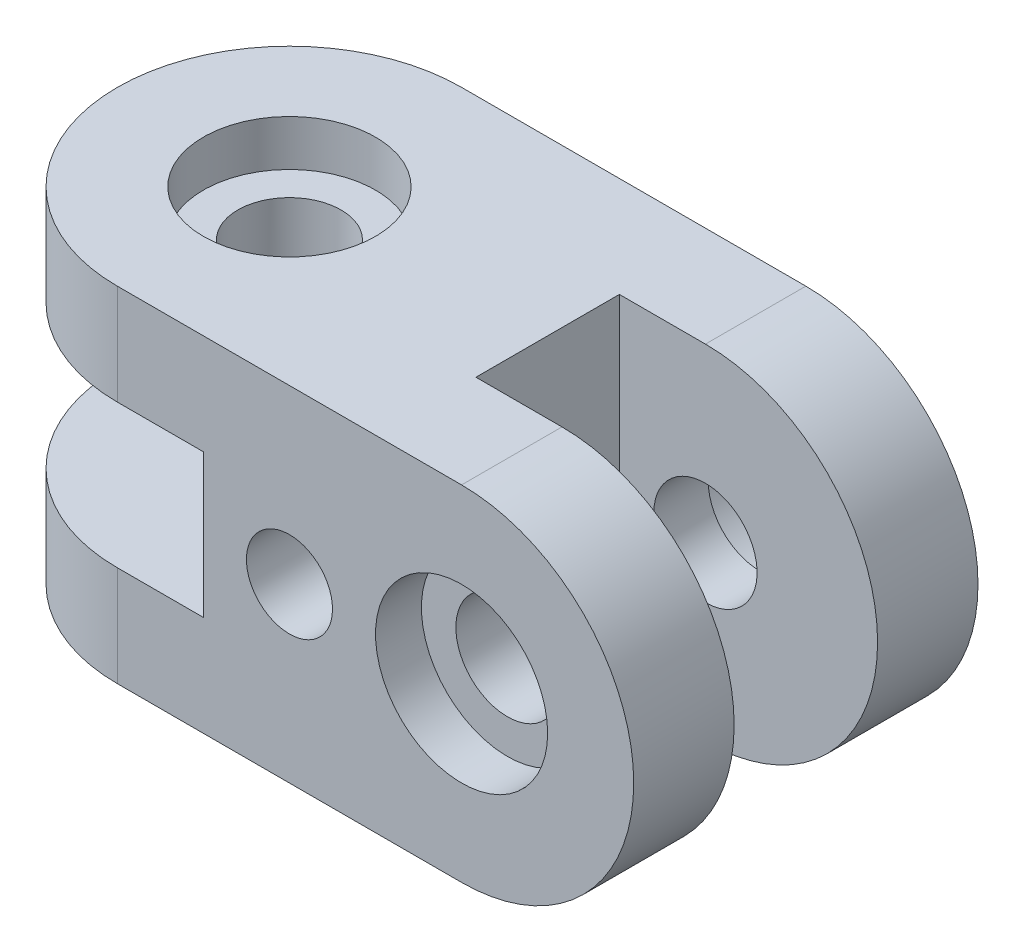
ISO-10303-21;
HEADER;
FILE_DESCRIPTION(('STEP AP214'),'2;1');
FILE_NAME('part.step','',(''),(''),'','','');
FILE_SCHEMA(('AUTOMOTIVE_DESIGN { 1 0 10303 214 1 1 1 1 }'));
ENDSEC;
DATA;
#1=APPLICATION_CONTEXT('core data for automotive mechanical design processes');
#2=APPLICATION_PROTOCOL_DEFINITION('international standard','automotive_design',2000,#1);
#3=PRODUCT_CONTEXT('',#1,'mechanical');
#4=PRODUCT('Part','Part','',(#3));
#5=PRODUCT_RELATED_PRODUCT_CATEGORY('part','',(#4));
#6=PRODUCT_DEFINITION_FORMATION('','',#4);
#7=PRODUCT_DEFINITION_CONTEXT('part definition',#1,'design');
#8=PRODUCT_DEFINITION('design','',#6,#7);
#9=PRODUCT_DEFINITION_SHAPE('','',#8);
#10=(LENGTH_UNIT() NAMED_UNIT(*) SI_UNIT(.MILLI.,.METRE.));
#11=(NAMED_UNIT(*) PLANE_ANGLE_UNIT() SI_UNIT($,.RADIAN.));
#12=(NAMED_UNIT(*) SI_UNIT($,.STERADIAN.) SOLID_ANGLE_UNIT());
#13=UNCERTAINTY_MEASURE_WITH_UNIT(LENGTH_MEASURE(1.E-05),#10,'distance_accuracy_value','');
#14=(GEOMETRIC_REPRESENTATION_CONTEXT(3) GLOBAL_UNCERTAINTY_ASSIGNED_CONTEXT((#13)) GLOBAL_UNIT_ASSIGNED_CONTEXT((#10,
#11,#12)) REPRESENTATION_CONTEXT('',''));
#15=CARTESIAN_POINT('',(0.,0.,0.));
#16=DIRECTION('',(0.,0.,1.));
#17=DIRECTION('',(1.,0.,0.));
#18=AXIS2_PLACEMENT_3D('',#15,#16,#17);
#19=CARTESIAN_POINT('',(30.,0.,30.));
#20=DIRECTION('',(0.,0.,-1.));
#21=DIRECTION('',(-1.,0.,0.));
#22=AXIS2_PLACEMENT_3D('',#19,#20,#21);
#23=CYLINDRICAL_SURFACE('',#22,30.);
#24=CARTESIAN_POINT('',(30.,0.,12.5));
#25=DIRECTION('',(0.,0.,1.));
#26=DIRECTION('',(1.,0.,0.));
#27=AXIS2_PLACEMENT_3D('',#24,#25,#26);
#28=CIRCLE('',#27,30.);
#29=CARTESIAN_POINT('',(30.,-30.,12.5));
#30=VERTEX_POINT('',#29);
#31=CARTESIAN_POINT('',(30.,30.,12.5));
#32=VERTEX_POINT('',#31);
#33=EDGE_CURVE('E11',#30,#32,#28,.T.);
#34=ORIENTED_EDGE('',*,*,#33,.T.);
#35=DIRECTION('',(0.,0.,-1.));
#36=VECTOR('',#35,1.);
#37=CARTESIAN_POINT('',(30.,30.,30.));
#38=LINE('',#37,#36);
#39=CARTESIAN_POINT('',(30.,30.,30.));
#40=VERTEX_POINT('',#39);
#41=EDGE_CURVE('E235',#40,#32,#38,.T.);
#42=ORIENTED_EDGE('',*,*,#41,.F.);
#43=CARTESIAN_POINT('',(30.,0.,30.));
#44=DIRECTION('',(0.,0.,1.));
#45=DIRECTION('',(-1.,0.,0.));
#46=AXIS2_PLACEMENT_3D('',#43,#44,#45);
#47=CIRCLE('',#46,30.);
#48=CARTESIAN_POINT('',(30.,-30.,30.));
#49=VERTEX_POINT('',#48);
#50=EDGE_CURVE('E201',#49,#40,#47,.T.);
#51=ORIENTED_EDGE('',*,*,#50,.F.);
#52=DIRECTION('',(0.,0.,-1.));
#53=VECTOR('',#52,1.);
#54=CARTESIAN_POINT('',(30.,-30.,30.));
#55=LINE('',#54,#53);
#56=EDGE_CURVE('E238',#49,#30,#55,.T.);
#57=ORIENTED_EDGE('',*,*,#56,.T.);
#58=EDGE_LOOP('',(#34,#42,#51,#57));
#59=FACE_BOUND('',#58,.T.);
#60=ADVANCED_FACE('F33',(#59),#23,.T.);
#61=CARTESIAN_POINT('',(-60.,-30.,30.));
#62=DIRECTION('',(0.,1.,0.));
#63=DIRECTION('',(0.,0.,1.));
#64=AXIS2_PLACEMENT_3D('',#61,#62,#63);
#65=PLANE('',#64);
#66=CARTESIAN_POINT('',(-30.,-30.,0.));
#67=DIRECTION('',(0.,1.,0.));
#68=DIRECTION('',(0.,0.,1.));
#69=AXIS2_PLACEMENT_3D('',#66,#67,#68);
#70=CIRCLE('',#69,15.);
#71=CARTESIAN_POINT('',(-30.,-30.,15.));
#72=VERTEX_POINT('',#71);
#73=EDGE_CURVE('E156',#72,#72,#70,.T.);
#74=ORIENTED_EDGE('',*,*,#73,.T.);
#75=EDGE_LOOP('',(#74));
#76=FACE_BOUND('',#75,.T.);
#77=DIRECTION('',(0.,0.,1.));
#78=VECTOR('',#77,1.);
#79=CARTESIAN_POINT('',(15.,-30.,12.5));
#80=LINE('',#79,#78);
#81=CARTESIAN_POINT('',(15.,-30.,-12.5));
#82=VERTEX_POINT('',#81);
#83=CARTESIAN_POINT('',(15.,-30.,12.5));
#84=VERTEX_POINT('',#83);
#85=EDGE_CURVE('E135',#82,#84,#80,.T.);
#86=ORIENTED_EDGE('',*,*,#85,.T.);
#87=DIRECTION('',(1.,0.,0.));
#88=VECTOR('',#87,1.);
#89=CARTESIAN_POINT('',(15.,-30.,12.5));
#90=LINE('',#89,#88);
#91=EDGE_CURVE('E137',#84,#30,#90,.T.);
#92=ORIENTED_EDGE('',*,*,#91,.T.);
#93=ORIENTED_EDGE('',*,*,#56,.F.);
#94=DIRECTION('',(1.,0.,0.));
#95=VECTOR('',#94,1.);
#96=CARTESIAN_POINT('',(-60.,-30.,30.));
#97=LINE('',#96,#95);
#98=CARTESIAN_POINT('',(-30.,-30.,30.));
#99=VERTEX_POINT('',#98);
#100=EDGE_CURVE('E199',#99,#49,#97,.T.);
#101=ORIENTED_EDGE('',*,*,#100,.F.);
#102=CARTESIAN_POINT('',(-30.,-30.,0.));
#103=DIRECTION('',(0.,-1.,0.));
#104=DIRECTION('',(0.,0.,1.));
#105=AXIS2_PLACEMENT_3D('',#102,#103,#104);
#106=CIRCLE('',#105,30.);
#107=CARTESIAN_POINT('',(-30.,-30.,-30.));
#108=VERTEX_POINT('',#107);
#109=EDGE_CURVE('E176',#99,#108,#106,.T.);
#110=ORIENTED_EDGE('',*,*,#109,.T.);
#111=DIRECTION('',(1.,0.,0.));
#112=VECTOR('',#111,1.);
#113=CARTESIAN_POINT('',(-60.,-30.,-30.));
#114=LINE('',#113,#112);
#115=CARTESIAN_POINT('',(30.,-30.,-30.));
#116=VERTEX_POINT('',#115);
#117=EDGE_CURVE('E198',#108,#116,#114,.T.);
#118=ORIENTED_EDGE('',*,*,#117,.T.);
#119=CARTESIAN_POINT('',(30.,-30.,-12.5));
#120=VERTEX_POINT('',#119);
#121=EDGE_CURVE('E237',#120,#116,#55,.T.);
#122=ORIENTED_EDGE('',*,*,#121,.F.);
#123=DIRECTION('',(-1.,0.,0.));
#124=VECTOR('',#123,1.);
#125=CARTESIAN_POINT('',(15.,-30.,-12.5));
#126=LINE('',#125,#124);
#127=EDGE_CURVE('E48',#120,#82,#126,.T.);
#128=ORIENTED_EDGE('',*,*,#127,.T.);
#129=EDGE_LOOP('',(#86,#92,#93,#101,#110,#118,#122,#128));
#130=FACE_BOUND('',#129,.T.);
#131=ADVANCED_FACE('F35',(#76,#130),#65,.F.);
#132=CARTESIAN_POINT('',(-60.,30.,30.));
#133=DIRECTION('',(0.,-1.,0.));
#134=DIRECTION('',(0.,0.,-1.));
#135=AXIS2_PLACEMENT_3D('',#132,#133,#134);
#136=PLANE('',#135);
#137=CARTESIAN_POINT('',(-30.,30.,0.));
#138=DIRECTION('',(0.,1.,0.));
#139=DIRECTION('',(0.,0.,1.));
#140=AXIS2_PLACEMENT_3D('',#137,#138,#139);
#141=CIRCLE('',#140,15.);
#142=CARTESIAN_POINT('',(-30.,30.,15.));
#143=VERTEX_POINT('',#142);
#144=EDGE_CURVE('E170',#143,#143,#141,.T.);
#145=ORIENTED_EDGE('',*,*,#144,.F.);
#146=EDGE_LOOP('',(#145));
#147=FACE_BOUND('',#146,.T.);
#148=ORIENTED_EDGE('',*,*,#41,.T.);
#149=DIRECTION('',(1.,0.,0.));
#150=VECTOR('',#149,1.);
#151=CARTESIAN_POINT('',(15.,30.,12.5));
#152=LINE('',#151,#150);
#153=CARTESIAN_POINT('',(15.,30.,12.5));
#154=VERTEX_POINT('',#153);
#155=EDGE_CURVE('E142',#154,#32,#152,.T.);
#156=ORIENTED_EDGE('',*,*,#155,.F.);
#157=DIRECTION('',(0.,0.,1.));
#158=VECTOR('',#157,1.);
#159=CARTESIAN_POINT('',(15.,30.,12.5));
#160=LINE('',#159,#158);
#161=CARTESIAN_POINT('',(15.,30.,-12.5));
#162=VERTEX_POINT('',#161);
#163=EDGE_CURVE('E127',#162,#154,#160,.T.);
#164=ORIENTED_EDGE('',*,*,#163,.F.);
#165=DIRECTION('',(-1.,0.,0.));
#166=VECTOR('',#165,1.);
#167=CARTESIAN_POINT('',(15.,30.,-12.5));
#168=LINE('',#167,#166);
#169=CARTESIAN_POINT('',(30.,30.,-12.5));
#170=VERTEX_POINT('',#169);
#171=EDGE_CURVE('E119',#170,#162,#168,.T.);
#172=ORIENTED_EDGE('',*,*,#171,.F.);
#173=CARTESIAN_POINT('',(30.,30.,-30.));
#174=VERTEX_POINT('',#173);
#175=EDGE_CURVE('E234',#170,#174,#38,.T.);
#176=ORIENTED_EDGE('',*,*,#175,.T.);
#177=DIRECTION('',(-1.,0.,0.));
#178=VECTOR('',#177,1.);
#179=CARTESIAN_POINT('',(-60.,30.,-30.));
#180=LINE('',#179,#178);
#181=CARTESIAN_POINT('',(-30.,30.,-30.));
#182=VERTEX_POINT('',#181);
#183=EDGE_CURVE('E220',#174,#182,#180,.T.);
#184=ORIENTED_EDGE('',*,*,#183,.T.);
#185=CARTESIAN_POINT('',(-30.,30.,0.));
#186=DIRECTION('',(0.,-1.,0.));
#187=DIRECTION('',(0.,0.,1.));
#188=AXIS2_PLACEMENT_3D('',#185,#186,#187);
#189=CIRCLE('',#188,30.);
#190=CARTESIAN_POINT('',(-30.,30.,30.));
#191=VERTEX_POINT('',#190);
#192=EDGE_CURVE('E56',#191,#182,#189,.T.);
#193=ORIENTED_EDGE('',*,*,#192,.F.);
#194=DIRECTION('',(-1.,0.,0.));
#195=VECTOR('',#194,1.);
#196=CARTESIAN_POINT('',(-60.,30.,30.));
#197=LINE('',#196,#195);
#198=EDGE_CURVE('E204',#40,#191,#197,.T.);
#199=ORIENTED_EDGE('',*,*,#198,.F.);
#200=EDGE_LOOP('',(#148,#156,#164,#172,#176,#184,#193,#199));
#201=FACE_BOUND('',#200,.T.);
#202=ADVANCED_FACE('F140',(#147,#201),#136,.F.);
#203=CARTESIAN_POINT('',(-15.,12.5,30.));
#204=DIRECTION('',(0.,1.,0.));
#205=DIRECTION('',(-1.,0.,0.));
#206=AXIS2_PLACEMENT_3D('',#203,#204,#205);
#207=PLANE('',#206);
#208=CARTESIAN_POINT('',(-30.,12.5,0.));
#209=DIRECTION('',(0.,1.,0.));
#210=DIRECTION('',(-1.,0.,0.));
#211=AXIS2_PLACEMENT_3D('',#208,#209,#210);
#212=CIRCLE('',#211,9.);
#213=CARTESIAN_POINT('',(-39.,12.5,0.));
#214=VERTEX_POINT('',#213);
#215=EDGE_CURVE('E167',#214,#214,#212,.F.);
#216=ORIENTED_EDGE('',*,*,#215,.F.);
#217=EDGE_LOOP('',(#216));
#218=FACE_BOUND('',#217,.T.);
#219=DIRECTION('',(1.,0.,0.));
#220=VECTOR('',#219,1.);
#221=CARTESIAN_POINT('',(-15.,12.5,30.));
#222=LINE('',#221,#220);
#223=CARTESIAN_POINT('',(-30.,12.5,30.));
#224=VERTEX_POINT('',#223);
#225=CARTESIAN_POINT('',(-15.,12.5,30.));
#226=VERTEX_POINT('',#225);
#227=EDGE_CURVE('E207',#224,#226,#222,.T.);
#228=ORIENTED_EDGE('',*,*,#227,.F.);
#229=CARTESIAN_POINT('',(-30.,12.5,0.));
#230=DIRECTION('',(0.,1.,0.));
#231=DIRECTION('',(-1.,0.,0.));
#232=AXIS2_PLACEMENT_3D('',#229,#230,#231);
#233=CIRCLE('',#232,30.);
#234=CARTESIAN_POINT('',(-30.,12.5,-30.));
#235=VERTEX_POINT('',#234);
#236=EDGE_CURVE('E189',#224,#235,#233,.F.);
#237=ORIENTED_EDGE('',*,*,#236,.T.);
#238=DIRECTION('',(1.,0.,0.));
#239=VECTOR('',#238,1.);
#240=CARTESIAN_POINT('',(-15.,12.5,-30.));
#241=LINE('',#240,#239);
#242=CARTESIAN_POINT('',(-15.,12.5,-30.));
#243=VERTEX_POINT('',#242);
#244=EDGE_CURVE('E223',#235,#243,#241,.T.);
#245=ORIENTED_EDGE('',*,*,#244,.T.);
#246=DIRECTION('',(0.,0.,-1.));
#247=VECTOR('',#246,1.);
#248=CARTESIAN_POINT('',(-15.,12.5,30.));
#249=LINE('',#248,#247);
#250=EDGE_CURVE('E231',#226,#243,#249,.T.);
#251=ORIENTED_EDGE('',*,*,#250,.F.);
#252=EDGE_LOOP('',(#228,#237,#245,#251));
#253=FACE_BOUND('',#252,.T.);
#254=ADVANCED_FACE('F298',(#218,#253),#207,.F.);
#255=CARTESIAN_POINT('',(-15.,-12.5,30.));
#256=DIRECTION('',(0.,-1.,0.));
#257=DIRECTION('',(1.,0.,0.));
#258=AXIS2_PLACEMENT_3D('',#255,#256,#257);
#259=PLANE('',#258);
#260=CARTESIAN_POINT('',(-30.,-12.5,0.));
#261=DIRECTION('',(0.,-1.,0.));
#262=DIRECTION('',(1.,0.,0.));
#263=AXIS2_PLACEMENT_3D('',#260,#261,#262);
#264=CIRCLE('',#263,9.);
#265=CARTESIAN_POINT('',(-21.,-12.5,0.));
#266=VERTEX_POINT('',#265);
#267=EDGE_CURVE('E151',#266,#266,#264,.T.);
#268=ORIENTED_EDGE('',*,*,#267,.T.);
#269=EDGE_LOOP('',(#268));
#270=FACE_BOUND('',#269,.T.);
#271=DIRECTION('',(-1.,0.,0.));
#272=VECTOR('',#271,1.);
#273=CARTESIAN_POINT('',(-15.,-12.5,-30.));
#274=LINE('',#273,#272);
#275=CARTESIAN_POINT('',(-15.,-12.5,-30.));
#276=VERTEX_POINT('',#275);
#277=CARTESIAN_POINT('',(-30.,-12.5,-30.));
#278=VERTEX_POINT('',#277);
#279=EDGE_CURVE('E202',#276,#278,#274,.T.);
#280=ORIENTED_EDGE('',*,*,#279,.T.);
#281=CARTESIAN_POINT('',(-30.,-12.5,0.));
#282=DIRECTION('',(0.,-1.,0.));
#283=DIRECTION('',(1.,0.,0.));
#284=AXIS2_PLACEMENT_3D('',#281,#282,#283);
#285=CIRCLE('',#284,30.);
#286=CARTESIAN_POINT('',(-30.,-12.5,30.));
#287=VERTEX_POINT('',#286);
#288=EDGE_CURVE('E184',#278,#287,#285,.F.);
#289=ORIENTED_EDGE('',*,*,#288,.T.);
#290=DIRECTION('',(-1.,0.,0.));
#291=VECTOR('',#290,1.);
#292=CARTESIAN_POINT('',(-15.,-12.5,30.));
#293=LINE('',#292,#291);
#294=CARTESIAN_POINT('',(-15.,-12.5,30.));
#295=VERTEX_POINT('',#294);
#296=EDGE_CURVE('E211',#295,#287,#293,.T.);
#297=ORIENTED_EDGE('',*,*,#296,.F.);
#298=DIRECTION('',(0.,0.,-1.));
#299=VECTOR('',#298,1.);
#300=CARTESIAN_POINT('',(-15.,-12.5,30.));
#301=LINE('',#300,#299);
#302=EDGE_CURVE('E214',#295,#276,#301,.T.);
#303=ORIENTED_EDGE('',*,*,#302,.T.);
#304=EDGE_LOOP('',(#280,#289,#297,#303));
#305=FACE_BOUND('',#304,.T.);
#306=ADVANCED_FACE('F291',(#270,#305),#259,.F.);
#307=ORIENTED_EDGE('',*,*,#175,.F.);
#308=CARTESIAN_POINT('',(30.,0.,-12.5));
#309=DIRECTION('',(0.,0.,-1.));
#310=DIRECTION('',(-1.,0.,0.));
#311=AXIS2_PLACEMENT_3D('',#308,#309,#310);
#312=CIRCLE('',#311,30.);
#313=EDGE_CURVE('E41',#170,#120,#312,.T.);
#314=ORIENTED_EDGE('',*,*,#313,.T.);
#315=ORIENTED_EDGE('',*,*,#121,.T.);
#316=CARTESIAN_POINT('',(30.,0.,-30.));
#317=DIRECTION('',(0.,0.,1.));
#318=DIRECTION('',(-1.,0.,0.));
#319=AXIS2_PLACEMENT_3D('',#316,#317,#318);
#320=CIRCLE('',#319,30.);
#321=EDGE_CURVE('E217',#116,#174,#320,.T.);
#322=ORIENTED_EDGE('',*,*,#321,.T.);
#323=EDGE_LOOP('',(#307,#314,#315,#322));
#324=FACE_BOUND('',#323,.T.);
#325=ADVANCED_FACE('F244',(#324),#23,.T.);
#326=CARTESIAN_POINT('',(-15.,-12.5,30.));
#327=DIRECTION('',(1.,0.,0.));
#328=DIRECTION('',(0.,0.,-1.));
#329=AXIS2_PLACEMENT_3D('',#326,#327,#328);
#330=PLANE('',#329);
#331=DIRECTION('',(0.,-1.,0.));
#332=VECTOR('',#331,1.);
#333=CARTESIAN_POINT('',(-15.,-12.5,-30.));
#334=LINE('',#333,#332);
#335=EDGE_CURVE('E225',#243,#276,#334,.T.);
#336=ORIENTED_EDGE('',*,*,#335,.T.);
#337=ORIENTED_EDGE('',*,*,#302,.F.);
#338=DIRECTION('',(0.,-1.,0.));
#339=VECTOR('',#338,1.);
#340=CARTESIAN_POINT('',(-15.,-12.5,30.));
#341=LINE('',#340,#339);
#342=EDGE_CURVE('E209',#226,#295,#341,.T.);
#343=ORIENTED_EDGE('',*,*,#342,.F.);
#344=ORIENTED_EDGE('',*,*,#250,.T.);
#345=EDGE_LOOP('',(#336,#337,#343,#344));
#346=FACE_BOUND('',#345,.T.);
#347=ADVANCED_FACE('F290',(#346),#330,.F.);
#348=CARTESIAN_POINT('',(30.,0.,30.));
#349=DIRECTION('',(0.,0.,-1.));
#350=DIRECTION('',(-1.,0.,0.));
#351=AXIS2_PLACEMENT_3D('',#348,#349,#350);
#352=PLANE('',#351);
#353=CARTESIAN_POINT('',(30.,0.,30.));
#354=DIRECTION('',(0.,0.,1.));
#355=DIRECTION('',(1.,0.,0.));
#356=AXIS2_PLACEMENT_3D('',#353,#354,#355);
#357=CIRCLE('',#356,15.);
#358=CARTESIAN_POINT('',(45.,0.,30.));
#359=VERTEX_POINT('',#358);
#360=EDGE_CURVE('E347',#359,#359,#357,.T.);
#361=ORIENTED_EDGE('',*,*,#360,.F.);
#362=EDGE_LOOP('',(#361));
#363=FACE_BOUND('',#362,.T.);
#364=CARTESIAN_POINT('',(0.,0.,30.));
#365=DIRECTION('',(0.,0.,1.));
#366=DIRECTION('',(1.,0.,0.));
#367=AXIS2_PLACEMENT_3D('',#364,#365,#366);
#368=CIRCLE('',#367,7.5);
#369=CARTESIAN_POINT('',(7.5,0.,30.));
#370=VERTEX_POINT('',#369);
#371=EDGE_CURVE('E192',#370,#370,#368,.T.);
#372=ORIENTED_EDGE('',*,*,#371,.F.);
#373=EDGE_LOOP('',(#372));
#374=FACE_BOUND('',#373,.T.);
#375=ORIENTED_EDGE('',*,*,#198,.T.);
#376=DIRECTION('',(0.,1.,0.));
#377=VECTOR('',#376,1.);
#378=CARTESIAN_POINT('',(-30.,-30.,30.));
#379=LINE('',#378,#377);
#380=EDGE_CURVE('E185',#224,#191,#379,.T.);
#381=ORIENTED_EDGE('',*,*,#380,.F.);
#382=ORIENTED_EDGE('',*,*,#227,.T.);
#383=ORIENTED_EDGE('',*,*,#342,.T.);
#384=ORIENTED_EDGE('',*,*,#296,.T.);
#385=EDGE_CURVE('E181',#99,#287,#379,.T.);
#386=ORIENTED_EDGE('',*,*,#385,.F.);
#387=ORIENTED_EDGE('',*,*,#100,.T.);
#388=ORIENTED_EDGE('',*,*,#50,.T.);
#389=EDGE_LOOP('',(#375,#381,#382,#383,#384,#386,#387,#388));
#390=FACE_BOUND('',#389,.T.);
#391=ADVANCED_FACE('F257',(#363,#374,#390),#352,.F.);
#392=CARTESIAN_POINT('',(30.,0.,-30.));
#393=DIRECTION('',(0.,0.,-1.));
#394=DIRECTION('',(-1.,0.,0.));
#395=AXIS2_PLACEMENT_3D('',#392,#393,#394);
#396=PLANE('',#395);
#397=CARTESIAN_POINT('',(30.,0.,-30.));
#398=DIRECTION('',(0.,0.,1.));
#399=DIRECTION('',(1.,0.,0.));
#400=AXIS2_PLACEMENT_3D('',#397,#398,#399);
#401=CIRCLE('',#400,15.);
#402=CARTESIAN_POINT('',(45.,0.,-30.));
#403=VERTEX_POINT('',#402);
#404=EDGE_CURVE('E361',#403,#403,#401,.T.);
#405=ORIENTED_EDGE('',*,*,#404,.T.);
#406=EDGE_LOOP('',(#405));
#407=FACE_BOUND('',#406,.T.);
#408=DIRECTION('',(0.,-1.,0.));
#409=VECTOR('',#408,1.);
#410=CARTESIAN_POINT('',(-30.,0.,-30.));
#411=LINE('',#410,#409);
#412=EDGE_CURVE('E241',#182,#235,#411,.T.);
#413=ORIENTED_EDGE('',*,*,#412,.F.);
#414=ORIENTED_EDGE('',*,*,#183,.F.);
#415=ORIENTED_EDGE('',*,*,#321,.F.);
#416=ORIENTED_EDGE('',*,*,#117,.F.);
#417=DIRECTION('',(0.,1.,0.));
#418=VECTOR('',#417,1.);
#419=CARTESIAN_POINT('',(-30.,-30.,-30.));
#420=LINE('',#419,#418);
#421=EDGE_CURVE('E179',#108,#278,#420,.T.);
#422=ORIENTED_EDGE('',*,*,#421,.T.);
#423=ORIENTED_EDGE('',*,*,#279,.F.);
#424=ORIENTED_EDGE('',*,*,#335,.F.);
#425=ORIENTED_EDGE('',*,*,#244,.F.);
#426=EDGE_LOOP('',(#413,#414,#415,#416,#422,#423,#424,#425));
#427=FACE_BOUND('',#426,.T.);
#428=CARTESIAN_POINT('',(0.,0.,-30.));
#429=DIRECTION('',(0.,0.,1.));
#430=DIRECTION('',(1.,0.,0.));
#431=AXIS2_PLACEMENT_3D('',#428,#429,#430);
#432=CIRCLE('',#431,7.5);
#433=CARTESIAN_POINT('',(7.5,0.,-30.));
#434=VERTEX_POINT('',#433);
#435=EDGE_CURVE('E195',#434,#434,#432,.T.);
#436=ORIENTED_EDGE('',*,*,#435,.T.);
#437=EDGE_LOOP('',(#436));
#438=FACE_BOUND('',#437,.T.);
#439=ADVANCED_FACE('F251',(#407,#427,#438),#396,.T.);
#440=CARTESIAN_POINT('',(0.,0.,-30.));
#441=DIRECTION('',(0.,0.,1.));
#442=DIRECTION('',(1.,0.,0.));
#443=AXIS2_PLACEMENT_3D('',#440,#441,#442);
#444=CYLINDRICAL_SURFACE('',#443,7.5);
#445=ORIENTED_EDGE('',*,*,#435,.F.);
#446=EDGE_LOOP('',(#445));
#447=FACE_BOUND('',#446,.T.);
#448=ORIENTED_EDGE('',*,*,#371,.T.);
#449=EDGE_LOOP('',(#448));
#450=FACE_BOUND('',#449,.T.);
#451=ADVANCED_FACE('F334',(#447,#450),#444,.F.);
#452=CARTESIAN_POINT('',(-30.,-30.,0.));
#453=DIRECTION('',(0.,1.,0.));
#454=DIRECTION('',(0.,0.,1.));
#455=AXIS2_PLACEMENT_3D('',#452,#453,#454);
#456=CYLINDRICAL_SURFACE('',#455,30.);
#457=ORIENTED_EDGE('',*,*,#288,.F.);
#458=ORIENTED_EDGE('',*,*,#421,.F.);
#459=ORIENTED_EDGE('',*,*,#109,.F.);
#460=ORIENTED_EDGE('',*,*,#385,.T.);
#461=EDGE_LOOP('',(#457,#458,#459,#460));
#462=FACE_BOUND('',#461,.T.);
#463=ADVANCED_FACE('F328',(#462),#456,.T.);
#464=ORIENTED_EDGE('',*,*,#192,.T.);
#465=ORIENTED_EDGE('',*,*,#412,.T.);
#466=ORIENTED_EDGE('',*,*,#236,.F.);
#467=ORIENTED_EDGE('',*,*,#380,.T.);
#468=EDGE_LOOP('',(#464,#465,#466,#467));
#469=FACE_BOUND('',#468,.T.);
#470=ADVANCED_FACE('F318',(#469),#456,.T.);
#471=CARTESIAN_POINT('',(-30.,22.,0.));
#472=DIRECTION('',(0.,1.,0.));
#473=DIRECTION('',(0.,0.,1.));
#474=AXIS2_PLACEMENT_3D('',#471,#472,#473);
#475=CYLINDRICAL_SURFACE('',#474,15.);
#476=CARTESIAN_POINT('',(-30.,22.,0.));
#477=DIRECTION('',(0.,1.,0.));
#478=DIRECTION('',(0.,0.,1.));
#479=AXIS2_PLACEMENT_3D('',#476,#477,#478);
#480=CIRCLE('',#479,15.);
#481=CARTESIAN_POINT('',(-30.,22.,15.));
#482=VERTEX_POINT('',#481);
#483=EDGE_CURVE('E171',#482,#482,#480,.T.);
#484=ORIENTED_EDGE('',*,*,#483,.F.);
#485=EDGE_LOOP('',(#484));
#486=FACE_BOUND('',#485,.T.);
#487=ORIENTED_EDGE('',*,*,#144,.T.);
#488=EDGE_LOOP('',(#487));
#489=FACE_BOUND('',#488,.T.);
#490=ADVANCED_FACE('F315',(#486,#489),#475,.F.);
#491=CARTESIAN_POINT('',(-30.,22.,0.));
#492=DIRECTION('',(0.,1.,0.));
#493=DIRECTION('',(0.,0.,1.));
#494=AXIS2_PLACEMENT_3D('',#491,#492,#493);
#495=PLANE('',#494);
#496=CARTESIAN_POINT('',(-30.,22.,0.));
#497=DIRECTION('',(0.,1.,0.));
#498=DIRECTION('',(0.,0.,1.));
#499=AXIS2_PLACEMENT_3D('',#496,#497,#498);
#500=CIRCLE('',#499,9.);
#501=CARTESIAN_POINT('',(-30.,22.,9.));
#502=VERTEX_POINT('',#501);
#503=EDGE_CURVE('E162',#502,#502,#500,.T.);
#504=ORIENTED_EDGE('',*,*,#503,.F.);
#505=EDGE_LOOP('',(#504));
#506=FACE_BOUND('',#505,.T.);
#507=ORIENTED_EDGE('',*,*,#483,.T.);
#508=EDGE_LOOP('',(#507));
#509=FACE_BOUND('',#508,.T.);
#510=ADVANCED_FACE('F317',(#506,#509),#495,.T.);
#511=CARTESIAN_POINT('',(-30.,-30.001,0.));
#512=DIRECTION('',(0.,1.,0.));
#513=DIRECTION('',(0.,0.,1.));
#514=AXIS2_PLACEMENT_3D('',#511,#512,#513);
#515=CYLINDRICAL_SURFACE('',#514,9.);
#516=ORIENTED_EDGE('',*,*,#503,.T.);
#517=EDGE_LOOP('',(#516));
#518=FACE_BOUND('',#517,.T.);
#519=ORIENTED_EDGE('',*,*,#215,.T.);
#520=EDGE_LOOP('',(#519));
#521=FACE_BOUND('',#520,.T.);
#522=ADVANCED_FACE('F325',(#518,#521),#515,.F.);
#523=CARTESIAN_POINT('',(-30.,-22.,0.));
#524=DIRECTION('',(0.,-1.,0.));
#525=DIRECTION('',(0.,0.,-1.));
#526=AXIS2_PLACEMENT_3D('',#523,#524,#525);
#527=CYLINDRICAL_SURFACE('',#526,15.);
#528=CARTESIAN_POINT('',(-30.,-22.,0.));
#529=DIRECTION('',(0.,1.,0.));
#530=DIRECTION('',(0.,0.,1.));
#531=AXIS2_PLACEMENT_3D('',#528,#529,#530);
#532=CIRCLE('',#531,15.);
#533=CARTESIAN_POINT('',(-30.,-22.,15.));
#534=VERTEX_POINT('',#533);
#535=EDGE_CURVE('E159',#534,#534,#532,.T.);
#536=ORIENTED_EDGE('',*,*,#535,.T.);
#537=EDGE_LOOP('',(#536));
#538=FACE_BOUND('',#537,.T.);
#539=ORIENTED_EDGE('',*,*,#73,.F.);
#540=EDGE_LOOP('',(#539));
#541=FACE_BOUND('',#540,.T.);
#542=ADVANCED_FACE('F410',(#538,#541),#527,.F.);
#543=CARTESIAN_POINT('',(-30.,-22.,0.));
#544=DIRECTION('',(0.,-1.,0.));
#545=DIRECTION('',(0.,0.,1.));
#546=AXIS2_PLACEMENT_3D('',#543,#544,#545);
#547=PLANE('',#546);
#548=CARTESIAN_POINT('',(-30.,-22.,0.));
#549=DIRECTION('',(0.,1.,0.));
#550=DIRECTION('',(0.,0.,1.));
#551=AXIS2_PLACEMENT_3D('',#548,#549,#550);
#552=CIRCLE('',#551,9.);
#553=CARTESIAN_POINT('',(-30.,-22.,9.));
#554=VERTEX_POINT('',#553);
#555=EDGE_CURVE('E153',#554,#554,#552,.T.);
#556=ORIENTED_EDGE('',*,*,#555,.T.);
#557=EDGE_LOOP('',(#556));
#558=FACE_BOUND('',#557,.T.);
#559=ORIENTED_EDGE('',*,*,#535,.F.);
#560=EDGE_LOOP('',(#559));
#561=FACE_BOUND('',#560,.T.);
#562=ADVANCED_FACE('F277',(#558,#561),#547,.T.);
#563=CARTESIAN_POINT('',(-30.,30.001,0.));
#564=DIRECTION('',(0.,-1.,0.));
#565=DIRECTION('',(0.,0.,-1.));
#566=AXIS2_PLACEMENT_3D('',#563,#564,#565);
#567=CYLINDRICAL_SURFACE('',#566,9.);
#568=ORIENTED_EDGE('',*,*,#555,.F.);
#569=EDGE_LOOP('',(#568));
#570=FACE_BOUND('',#569,.T.);
#571=ORIENTED_EDGE('',*,*,#267,.F.);
#572=EDGE_LOOP('',(#571));
#573=FACE_BOUND('',#572,.T.);
#574=ADVANCED_FACE('F268',(#570,#573),#567,.F.);
#575=CARTESIAN_POINT('',(15.,-30.,12.5));
#576=DIRECTION('',(0.,0.,1.));
#577=DIRECTION('',(1.,0.,0.));
#578=AXIS2_PLACEMENT_3D('',#575,#576,#577);
#579=PLANE('',#578);
#580=CARTESIAN_POINT('',(30.,0.,12.5));
#581=DIRECTION('',(0.,0.,1.));
#582=DIRECTION('',(1.,0.,0.));
#583=AXIS2_PLACEMENT_3D('',#580,#581,#582);
#584=CIRCLE('',#583,9.);
#585=CARTESIAN_POINT('',(39.,0.,12.5));
#586=VERTEX_POINT('',#585);
#587=EDGE_CURVE('E351',#586,#586,#584,.F.);
#588=ORIENTED_EDGE('',*,*,#587,.F.);
#589=EDGE_LOOP('',(#588));
#590=FACE_BOUND('',#589,.T.);
#591=ORIENTED_EDGE('',*,*,#33,.F.);
#592=ORIENTED_EDGE('',*,*,#91,.F.);
#593=DIRECTION('',(0.,1.,0.));
#594=VECTOR('',#593,1.);
#595=CARTESIAN_POINT('',(15.,-30.,12.5));
#596=LINE('',#595,#594);
#597=EDGE_CURVE('E136',#84,#154,#596,.T.);
#598=ORIENTED_EDGE('',*,*,#597,.T.);
#599=ORIENTED_EDGE('',*,*,#155,.T.);
#600=EDGE_LOOP('',(#591,#592,#598,#599));
#601=FACE_BOUND('',#600,.T.);
#602=ADVANCED_FACE('F266',(#590,#601),#579,.F.);
#603=CARTESIAN_POINT('',(15.,-30.,-12.5));
#604=DIRECTION('',(0.,0.,-1.));
#605=DIRECTION('',(-1.,0.,0.));
#606=AXIS2_PLACEMENT_3D('',#603,#604,#605);
#607=PLANE('',#606);
#608=CARTESIAN_POINT('',(30.,0.,-12.5));
#609=DIRECTION('',(0.,0.,-1.));
#610=DIRECTION('',(-1.,0.,0.));
#611=AXIS2_PLACEMENT_3D('',#608,#609,#610);
#612=CIRCLE('',#611,9.);
#613=CARTESIAN_POINT('',(21.,0.,-12.5));
#614=VERTEX_POINT('',#613);
#615=EDGE_CURVE('E367',#614,#614,#612,.T.);
#616=ORIENTED_EDGE('',*,*,#615,.T.);
#617=EDGE_LOOP('',(#616));
#618=FACE_BOUND('',#617,.T.);
#619=ORIENTED_EDGE('',*,*,#171,.T.);
#620=DIRECTION('',(0.,1.,0.));
#621=VECTOR('',#620,1.);
#622=CARTESIAN_POINT('',(15.,-30.,-12.5));
#623=LINE('',#622,#621);
#624=EDGE_CURVE('E122',#82,#162,#623,.T.);
#625=ORIENTED_EDGE('',*,*,#624,.F.);
#626=ORIENTED_EDGE('',*,*,#127,.F.);
#627=ORIENTED_EDGE('',*,*,#313,.F.);
#628=EDGE_LOOP('',(#619,#625,#626,#627));
#629=FACE_BOUND('',#628,.T.);
#630=ADVANCED_FACE('F121',(#618,#629),#607,.F.);
#631=CARTESIAN_POINT('',(15.,-30.,12.5));
#632=DIRECTION('',(-1.,0.,0.));
#633=DIRECTION('',(0.,0.,1.));
#634=AXIS2_PLACEMENT_3D('',#631,#632,#633);
#635=PLANE('',#634);
#636=ORIENTED_EDGE('',*,*,#597,.F.);
#637=ORIENTED_EDGE('',*,*,#85,.F.);
#638=ORIENTED_EDGE('',*,*,#624,.T.);
#639=ORIENTED_EDGE('',*,*,#163,.T.);
#640=EDGE_LOOP('',(#636,#637,#638,#639));
#641=FACE_BOUND('',#640,.T.);
#642=ADVANCED_FACE('F132',(#641),#635,.F.);
#643=CARTESIAN_POINT('',(30.,0.,22.));
#644=DIRECTION('',(0.,0.,1.));
#645=DIRECTION('',(1.,0.,0.));
#646=AXIS2_PLACEMENT_3D('',#643,#644,#645);
#647=CYLINDRICAL_SURFACE('',#646,15.);
#648=CARTESIAN_POINT('',(30.,0.,22.));
#649=DIRECTION('',(0.,0.,1.));
#650=DIRECTION('',(1.,0.,0.));
#651=AXIS2_PLACEMENT_3D('',#648,#649,#650);
#652=CIRCLE('',#651,15.);
#653=CARTESIAN_POINT('',(45.,0.,22.));
#654=VERTEX_POINT('',#653);
#655=EDGE_CURVE('E128',#654,#654,#652,.T.);
#656=ORIENTED_EDGE('',*,*,#655,.F.);
#657=EDGE_LOOP('',(#656));
#658=FACE_BOUND('',#657,.T.);
#659=ORIENTED_EDGE('',*,*,#360,.T.);
#660=EDGE_LOOP('',(#659));
#661=FACE_BOUND('',#660,.T.);
#662=ADVANCED_FACE('F396',(#658,#661),#647,.F.);
#663=CARTESIAN_POINT('',(30.,0.,22.));
#664=DIRECTION('',(0.,0.,1.));
#665=DIRECTION('',(1.,0.,0.));
#666=AXIS2_PLACEMENT_3D('',#663,#664,#665);
#667=PLANE('',#666);
#668=CARTESIAN_POINT('',(30.,0.,22.));
#669=DIRECTION('',(0.,0.,1.));
#670=DIRECTION('',(1.,0.,0.));
#671=AXIS2_PLACEMENT_3D('',#668,#669,#670);
#672=CIRCLE('',#671,9.);
#673=CARTESIAN_POINT('',(39.,0.,22.));
#674=VERTEX_POINT('',#673);
#675=EDGE_CURVE('E355',#674,#674,#672,.T.);
#676=ORIENTED_EDGE('',*,*,#675,.F.);
#677=EDGE_LOOP('',(#676));
#678=FACE_BOUND('',#677,.T.);
#679=ORIENTED_EDGE('',*,*,#655,.T.);
#680=EDGE_LOOP('',(#679));
#681=FACE_BOUND('',#680,.T.);
#682=ADVANCED_FACE('F393',(#678,#681),#667,.T.);
#683=CARTESIAN_POINT('',(30.,0.,-30.001));
#684=DIRECTION('',(0.,0.,1.));
#685=DIRECTION('',(1.,0.,0.));
#686=AXIS2_PLACEMENT_3D('',#683,#684,#685);
#687=CYLINDRICAL_SURFACE('',#686,9.);
#688=ORIENTED_EDGE('',*,*,#675,.T.);
#689=EDGE_LOOP('',(#688));
#690=FACE_BOUND('',#689,.T.);
#691=ORIENTED_EDGE('',*,*,#587,.T.);
#692=EDGE_LOOP('',(#691));
#693=FACE_BOUND('',#692,.T.);
#694=ADVANCED_FACE('F389',(#690,#693),#687,.F.);
#695=CARTESIAN_POINT('',(30.,0.,-22.));
#696=DIRECTION('',(0.,0.,-1.));
#697=DIRECTION('',(-1.,0.,0.));
#698=AXIS2_PLACEMENT_3D('',#695,#696,#697);
#699=CYLINDRICAL_SURFACE('',#698,15.);
#700=CARTESIAN_POINT('',(30.,0.,-22.));
#701=DIRECTION('',(0.,0.,1.));
#702=DIRECTION('',(1.,0.,0.));
#703=AXIS2_PLACEMENT_3D('',#700,#701,#702);
#704=CIRCLE('',#703,15.);
#705=CARTESIAN_POINT('',(45.,0.,-22.));
#706=VERTEX_POINT('',#705);
#707=EDGE_CURVE('E360',#706,#706,#704,.T.);
#708=ORIENTED_EDGE('',*,*,#707,.T.);
#709=EDGE_LOOP('',(#708));
#710=FACE_BOUND('',#709,.T.);
#711=ORIENTED_EDGE('',*,*,#404,.F.);
#712=EDGE_LOOP('',(#711));
#713=FACE_BOUND('',#712,.T.);
#714=ADVANCED_FACE('F384',(#710,#713),#699,.F.);
#715=CARTESIAN_POINT('',(30.,0.,-22.));
#716=DIRECTION('',(0.,0.,-1.));
#717=DIRECTION('',(1.,0.,0.));
#718=AXIS2_PLACEMENT_3D('',#715,#716,#717);
#719=PLANE('',#718);
#720=CARTESIAN_POINT('',(30.,0.,-22.));
#721=DIRECTION('',(0.,0.,1.));
#722=DIRECTION('',(1.,0.,0.));
#723=AXIS2_PLACEMENT_3D('',#720,#721,#722);
#724=CIRCLE('',#723,9.);
#725=CARTESIAN_POINT('',(39.,0.,-22.));
#726=VERTEX_POINT('',#725);
#727=EDGE_CURVE('E364',#726,#726,#724,.T.);
#728=ORIENTED_EDGE('',*,*,#727,.T.);
#729=EDGE_LOOP('',(#728));
#730=FACE_BOUND('',#729,.T.);
#731=ORIENTED_EDGE('',*,*,#707,.F.);
#732=EDGE_LOOP('',(#731));
#733=FACE_BOUND('',#732,.T.);
#734=ADVANCED_FACE('F373',(#730,#733),#719,.T.);
#735=CARTESIAN_POINT('',(30.,0.,30.001));
#736=DIRECTION('',(0.,0.,-1.));
#737=DIRECTION('',(-1.,0.,0.));
#738=AXIS2_PLACEMENT_3D('',#735,#736,#737);
#739=CYLINDRICAL_SURFACE('',#738,9.);
#740=ORIENTED_EDGE('',*,*,#727,.F.);
#741=EDGE_LOOP('',(#740));
#742=FACE_BOUND('',#741,.T.);
#743=ORIENTED_EDGE('',*,*,#615,.F.);
#744=EDGE_LOOP('',(#743));
#745=FACE_BOUND('',#744,.T.);
#746=ADVANCED_FACE('F376',(#742,#745),#739,.F.);
#747=CLOSED_SHELL('',(#60,#131,#202,#254,#306,#325,#347,#391,#439,#451,#463,#470,#490,#510,#522,
#542,#562,#574,#602,#630,#642,#662,#682,#694,#714,#734,#746));
#748=MANIFOLD_SOLID_BREP('B2',#747);
#749=ADVANCED_BREP_SHAPE_REPRESENTATION('',(#18,#748),#14);
#750=SHAPE_DEFINITION_REPRESENTATION(#9,#749);
ENDSEC;
END-ISO-10303-21;
